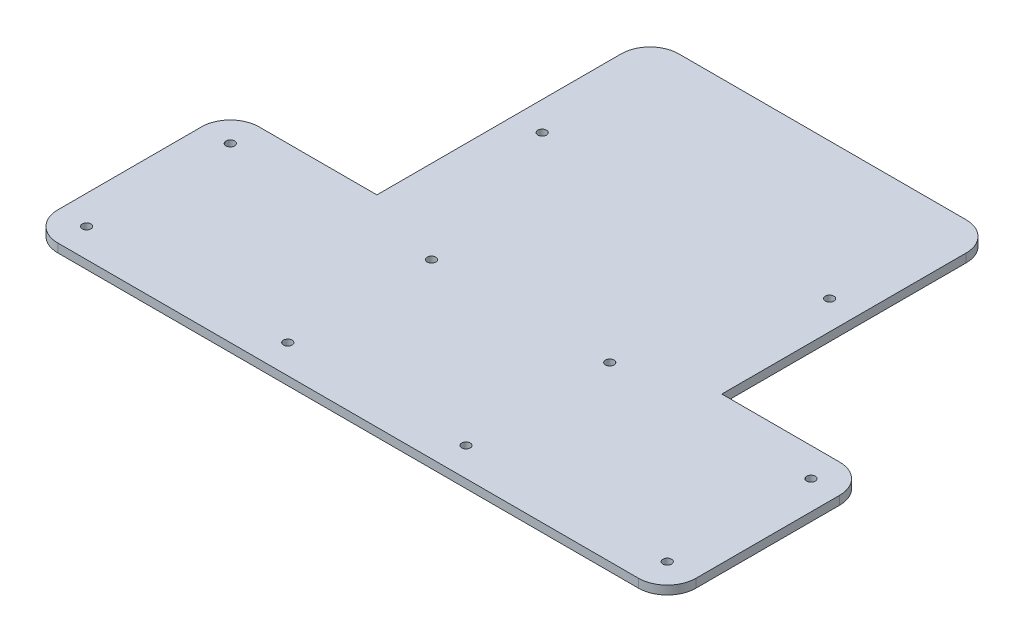
ISO-10303-21;
HEADER;
FILE_DESCRIPTION(('STEP AP214'),'2;1');
FILE_NAME('part.step','',(''),(''),'','','');
FILE_SCHEMA(('AUTOMOTIVE_DESIGN { 1 0 10303 214 1 1 1 1 }'));
ENDSEC;
DATA;
#1=APPLICATION_CONTEXT('core data for automotive mechanical design processes');
#2=APPLICATION_PROTOCOL_DEFINITION('international standard','automotive_design',2000,#1);
#3=PRODUCT_CONTEXT('',#1,'mechanical');
#4=PRODUCT('Part','Part','',(#3));
#5=PRODUCT_RELATED_PRODUCT_CATEGORY('part','',(#4));
#6=PRODUCT_DEFINITION_FORMATION('','',#4);
#7=PRODUCT_DEFINITION_CONTEXT('part definition',#1,'design');
#8=PRODUCT_DEFINITION('design','',#6,#7);
#9=PRODUCT_DEFINITION_SHAPE('','',#8);
#10=(LENGTH_UNIT() NAMED_UNIT(*) SI_UNIT(.MILLI.,.METRE.));
#11=(NAMED_UNIT(*) PLANE_ANGLE_UNIT() SI_UNIT($,.RADIAN.));
#12=(NAMED_UNIT(*) SI_UNIT($,.STERADIAN.) SOLID_ANGLE_UNIT());
#13=UNCERTAINTY_MEASURE_WITH_UNIT(LENGTH_MEASURE(1.E-05),#10,'distance_accuracy_value','');
#14=(GEOMETRIC_REPRESENTATION_CONTEXT(3) GLOBAL_UNCERTAINTY_ASSIGNED_CONTEXT((#13)) GLOBAL_UNIT_ASSIGNED_CONTEXT((#10,
#11,#12)) REPRESENTATION_CONTEXT('',''));
#15=CARTESIAN_POINT('',(0.,0.,0.));
#16=DIRECTION('',(0.,0.,1.));
#17=DIRECTION('',(1.,0.,0.));
#18=AXIS2_PLACEMENT_3D('',#15,#16,#17);
#19=CARTESIAN_POINT('',(0.,3.,0.));
#20=DIRECTION('',(0.,1.,0.));
#21=DIRECTION('',(0.,0.,1.));
#22=AXIS2_PLACEMENT_3D('',#19,#20,#21);
#23=PLANE('',#22);
#24=CARTESIAN_POINT('',(31.,3.,-25.));
#25=DIRECTION('',(0.,1.,0.));
#26=DIRECTION('',(0.,0.,-1.));
#27=AXIS2_PLACEMENT_3D('',#24,#25,#26);
#28=CIRCLE('',#27,1.5);
#29=CARTESIAN_POINT('',(31.,3.,-26.5));
#30=VERTEX_POINT('',#29);
#31=EDGE_CURVE('E335',#30,#30,#28,.T.);
#32=ORIENTED_EDGE('',*,*,#31,.F.);
#33=EDGE_LOOP('',(#32));
#34=FACE_BOUND('',#33,.T.);
#35=CARTESIAN_POINT('',(101.,3.,25.));
#36=DIRECTION('',(0.,1.,0.));
#37=DIRECTION('',(0.,0.,1.));
#38=AXIS2_PLACEMENT_3D('',#35,#36,#37);
#39=CIRCLE('',#38,1.5);
#40=CARTESIAN_POINT('',(101.,3.,26.5));
#41=VERTEX_POINT('',#40);
#42=EDGE_CURVE('E323',#41,#41,#39,.T.);
#43=ORIENTED_EDGE('',*,*,#42,.F.);
#44=EDGE_LOOP('',(#43));
#45=FACE_BOUND('',#44,.T.);
#46=CARTESIAN_POINT('',(-31.,3.,25.));
#47=DIRECTION('',(0.,1.,0.));
#48=DIRECTION('',(0.,0.,-1.));
#49=AXIS2_PLACEMENT_3D('',#46,#47,#48);
#50=CIRCLE('',#49,1.5);
#51=CARTESIAN_POINT('',(-31.,3.,23.5));
#52=VERTEX_POINT('',#51);
#53=EDGE_CURVE('E311',#52,#52,#50,.T.);
#54=ORIENTED_EDGE('',*,*,#53,.F.);
#55=EDGE_LOOP('',(#54));
#56=FACE_BOUND('',#55,.T.);
#57=CARTESIAN_POINT('',(-101.,3.,25.));
#58=DIRECTION('',(0.,1.,0.));
#59=DIRECTION('',(0.,0.,-1.));
#60=AXIS2_PLACEMENT_3D('',#57,#58,#59);
#61=CIRCLE('',#60,1.5);
#62=CARTESIAN_POINT('',(-101.,3.,23.5));
#63=VERTEX_POINT('',#62);
#64=EDGE_CURVE('E299',#63,#63,#61,.T.);
#65=ORIENTED_EDGE('',*,*,#64,.F.);
#66=EDGE_LOOP('',(#65));
#67=FACE_BOUND('',#66,.T.);
#68=CARTESIAN_POINT('',(-50.,3.,-82.5));
#69=DIRECTION('',(0.,1.,0.));
#70=DIRECTION('',(0.,0.,1.));
#71=AXIS2_PLACEMENT_3D('',#68,#69,#70);
#72=CIRCLE('',#71,1.5);
#73=CARTESIAN_POINT('',(-50.,3.,-81.));
#74=VERTEX_POINT('',#73);
#75=EDGE_CURVE('E179',#74,#74,#72,.T.);
#76=ORIENTED_EDGE('',*,*,#75,.F.);
#77=EDGE_LOOP('',(#76));
#78=FACE_BOUND('',#77,.T.);
#79=DIRECTION('',(-1.,0.,0.));
#80=VECTOR('',#79,1.);
#81=CARTESIAN_POINT('',(-60.,3.,-130.));
#82=LINE('',#81,#80);
#83=CARTESIAN_POINT('',(50.,3.,-130.));
#84=VERTEX_POINT('',#83);
#85=CARTESIAN_POINT('',(-50.,3.,-130.));
#86=VERTEX_POINT('',#85);
#87=EDGE_CURVE('E147',#84,#86,#82,.T.);
#88=ORIENTED_EDGE('',*,*,#87,.T.);
#89=CARTESIAN_POINT('',(-50.,3.,-120.));
#90=DIRECTION('',(0.,1.,0.));
#91=DIRECTION('',(0.,0.,1.));
#92=AXIS2_PLACEMENT_3D('',#89,#90,#91);
#93=CIRCLE('',#92,10.);
#94=CARTESIAN_POINT('',(-60.,3.,-120.));
#95=VERTEX_POINT('',#94);
#96=EDGE_CURVE('E143',#86,#95,#93,.T.);
#97=ORIENTED_EDGE('',*,*,#96,.T.);
#98=DIRECTION('',(0.,0.,1.));
#99=VECTOR('',#98,1.);
#100=CARTESIAN_POINT('',(-60.,3.,-130.));
#101=LINE('',#100,#99);
#102=CARTESIAN_POINT('',(-60.,3.,-35.));
#103=VERTEX_POINT('',#102);
#104=EDGE_CURVE('E135',#95,#103,#101,.T.);
#105=ORIENTED_EDGE('',*,*,#104,.T.);
#106=DIRECTION('',(-1.,0.,0.));
#107=VECTOR('',#106,1.);
#108=CARTESIAN_POINT('',(-60.,3.,-35.));
#109=LINE('',#108,#107);
#110=CARTESIAN_POINT('',(-101.,3.,-35.));
#111=VERTEX_POINT('',#110);
#112=EDGE_CURVE('E140',#103,#111,#109,.T.);
#113=ORIENTED_EDGE('',*,*,#112,.T.);
#114=CARTESIAN_POINT('',(-101.,3.,-25.));
#115=DIRECTION('',(0.,1.,0.));
#116=DIRECTION('',(0.,0.,1.));
#117=AXIS2_PLACEMENT_3D('',#114,#115,#116);
#118=CIRCLE('',#117,10.);
#119=CARTESIAN_POINT('',(-111.,3.,-25.));
#120=VERTEX_POINT('',#119);
#121=EDGE_CURVE('E216',#111,#120,#118,.T.);
#122=ORIENTED_EDGE('',*,*,#121,.T.);
#123=DIRECTION('',(0.,0.,1.));
#124=VECTOR('',#123,1.);
#125=CARTESIAN_POINT('',(-111.,3.,-35.));
#126=LINE('',#125,#124);
#127=CARTESIAN_POINT('',(-111.,3.,25.));
#128=VERTEX_POINT('',#127);
#129=EDGE_CURVE('E162',#120,#128,#126,.T.);
#130=ORIENTED_EDGE('',*,*,#129,.T.);
#131=CARTESIAN_POINT('',(-101.,3.,25.));
#132=DIRECTION('',(0.,1.,0.));
#133=DIRECTION('',(0.,0.,1.));
#134=AXIS2_PLACEMENT_3D('',#131,#132,#133);
#135=CIRCLE('',#134,10.);
#136=CARTESIAN_POINT('',(-101.,3.,35.));
#137=VERTEX_POINT('',#136);
#138=EDGE_CURVE('E218',#128,#137,#135,.T.);
#139=ORIENTED_EDGE('',*,*,#138,.T.);
#140=DIRECTION('',(1.,0.,0.));
#141=VECTOR('',#140,1.);
#142=CARTESIAN_POINT('',(111.,3.,35.));
#143=LINE('',#142,#141);
#144=CARTESIAN_POINT('',(101.,3.,35.));
#145=VERTEX_POINT('',#144);
#146=EDGE_CURVE('E165',#137,#145,#143,.T.);
#147=ORIENTED_EDGE('',*,*,#146,.T.);
#148=CARTESIAN_POINT('',(101.,3.,25.));
#149=DIRECTION('',(0.,1.,0.));
#150=DIRECTION('',(0.,0.,1.));
#151=AXIS2_PLACEMENT_3D('',#148,#149,#150);
#152=CIRCLE('',#151,10.);
#153=CARTESIAN_POINT('',(111.,3.,25.));
#154=VERTEX_POINT('',#153);
#155=EDGE_CURVE('E220',#145,#154,#152,.T.);
#156=ORIENTED_EDGE('',*,*,#155,.T.);
#157=DIRECTION('',(0.,0.,-1.));
#158=VECTOR('',#157,1.);
#159=CARTESIAN_POINT('',(111.,3.,-35.));
#160=LINE('',#159,#158);
#161=CARTESIAN_POINT('',(111.,3.,-25.));
#162=VERTEX_POINT('',#161);
#163=EDGE_CURVE('E171',#154,#162,#160,.T.);
#164=ORIENTED_EDGE('',*,*,#163,.T.);
#165=CARTESIAN_POINT('',(101.,3.,-25.));
#166=DIRECTION('',(0.,1.,0.));
#167=DIRECTION('',(0.,0.,1.));
#168=AXIS2_PLACEMENT_3D('',#165,#166,#167);
#169=CIRCLE('',#168,10.);
#170=CARTESIAN_POINT('',(101.,3.,-35.));
#171=VERTEX_POINT('',#170);
#172=EDGE_CURVE('E49',#162,#171,#169,.T.);
#173=ORIENTED_EDGE('',*,*,#172,.T.);
#174=DIRECTION('',(-1.,0.,0.));
#175=VECTOR('',#174,1.);
#176=CARTESIAN_POINT('',(60.,3.,-35.));
#177=LINE('',#176,#175);
#178=CARTESIAN_POINT('',(60.,3.,-35.));
#179=VERTEX_POINT('',#178);
#180=EDGE_CURVE('E173',#171,#179,#177,.T.);
#181=ORIENTED_EDGE('',*,*,#180,.T.);
#182=DIRECTION('',(0.,0.,-1.));
#183=VECTOR('',#182,1.);
#184=CARTESIAN_POINT('',(60.,3.,-130.));
#185=LINE('',#184,#183);
#186=CARTESIAN_POINT('',(60.,3.,-120.));
#187=VERTEX_POINT('',#186);
#188=EDGE_CURVE('E195',#179,#187,#185,.T.);
#189=ORIENTED_EDGE('',*,*,#188,.T.);
#190=CARTESIAN_POINT('',(50.,3.,-120.));
#191=DIRECTION('',(0.,1.,0.));
#192=DIRECTION('',(0.,0.,1.));
#193=AXIS2_PLACEMENT_3D('',#190,#191,#192);
#194=CIRCLE('',#193,10.);
#195=EDGE_CURVE('E223',#187,#84,#194,.T.);
#196=ORIENTED_EDGE('',*,*,#195,.T.);
#197=EDGE_LOOP('',(#88,#97,#105,#113,#122,#130,#139,#147,#156,#164,#173,#181,#189,#196));
#198=FACE_BOUND('',#197,.T.);
#199=CARTESIAN_POINT('',(-101.,3.,-25.));
#200=DIRECTION('',(0.,1.,0.));
#201=DIRECTION('',(0.,0.,1.));
#202=AXIS2_PLACEMENT_3D('',#199,#200,#201);
#203=CIRCLE('',#202,1.5);
#204=CARTESIAN_POINT('',(-101.,3.,-23.5));
#205=VERTEX_POINT('',#204);
#206=EDGE_CURVE('E293',#205,#205,#203,.T.);
#207=ORIENTED_EDGE('',*,*,#206,.F.);
#208=EDGE_LOOP('',(#207));
#209=FACE_BOUND('',#208,.T.);
#210=CARTESIAN_POINT('',(-31.,3.,-25.));
#211=DIRECTION('',(0.,1.,0.));
#212=DIRECTION('',(0.,0.,1.));
#213=AXIS2_PLACEMENT_3D('',#210,#211,#212);
#214=CIRCLE('',#213,1.5);
#215=CARTESIAN_POINT('',(-31.,3.,-23.5));
#216=VERTEX_POINT('',#215);
#217=EDGE_CURVE('E305',#216,#216,#214,.T.);
#218=ORIENTED_EDGE('',*,*,#217,.F.);
#219=EDGE_LOOP('',(#218));
#220=FACE_BOUND('',#219,.T.);
#221=CARTESIAN_POINT('',(101.,3.,-25.));
#222=DIRECTION('',(0.,1.,0.));
#223=DIRECTION('',(0.,0.,-1.));
#224=AXIS2_PLACEMENT_3D('',#221,#222,#223);
#225=CIRCLE('',#224,1.5);
#226=CARTESIAN_POINT('',(101.,3.,-26.5));
#227=VERTEX_POINT('',#226);
#228=EDGE_CURVE('E317',#227,#227,#225,.T.);
#229=ORIENTED_EDGE('',*,*,#228,.F.);
#230=EDGE_LOOP('',(#229));
#231=FACE_BOUND('',#230,.T.);
#232=CARTESIAN_POINT('',(31.,3.,25.));
#233=DIRECTION('',(0.,1.,0.));
#234=DIRECTION('',(0.,0.,1.));
#235=AXIS2_PLACEMENT_3D('',#232,#233,#234);
#236=CIRCLE('',#235,1.5);
#237=CARTESIAN_POINT('',(31.,3.,26.5));
#238=VERTEX_POINT('',#237);
#239=EDGE_CURVE('E329',#238,#238,#236,.T.);
#240=ORIENTED_EDGE('',*,*,#239,.F.);
#241=EDGE_LOOP('',(#240));
#242=FACE_BOUND('',#241,.T.);
#243=CARTESIAN_POINT('',(50.,3.,-82.5));
#244=DIRECTION('',(0.,1.,0.));
#245=DIRECTION('',(0.,0.,-1.));
#246=AXIS2_PLACEMENT_3D('',#243,#244,#245);
#247=CIRCLE('',#246,1.5);
#248=CARTESIAN_POINT('',(50.,3.,-84.));
#249=VERTEX_POINT('',#248);
#250=EDGE_CURVE('E341',#249,#249,#247,.T.);
#251=ORIENTED_EDGE('',*,*,#250,.F.);
#252=EDGE_LOOP('',(#251));
#253=FACE_BOUND('',#252,.T.);
#254=ADVANCED_FACE('F34',(#34,#45,#56,#67,#78,#198,#209,#220,#231,#242,#253),#23,.T.);
#255=CARTESIAN_POINT('',(0.,0.,0.));
#256=DIRECTION('',(0.,1.,0.));
#257=DIRECTION('',(0.,0.,1.));
#258=AXIS2_PLACEMENT_3D('',#255,#256,#257);
#259=PLANE('',#258);
#260=DIRECTION('',(0.,0.,1.));
#261=VECTOR('',#260,1.);
#262=CARTESIAN_POINT('',(-60.,0.,-130.));
#263=LINE('',#262,#261);
#264=CARTESIAN_POINT('',(-60.,0.,-120.));
#265=VERTEX_POINT('',#264);
#266=CARTESIAN_POINT('',(-60.,0.,-35.));
#267=VERTEX_POINT('',#266);
#268=EDGE_CURVE('E153',#265,#267,#263,.T.);
#269=ORIENTED_EDGE('',*,*,#268,.F.);
#270=CARTESIAN_POINT('',(-50.,0.,-120.));
#271=DIRECTION('',(0.,1.,0.));
#272=DIRECTION('',(0.,0.,1.));
#273=AXIS2_PLACEMENT_3D('',#270,#271,#272);
#274=CIRCLE('',#273,10.);
#275=CARTESIAN_POINT('',(-50.,0.,-130.));
#276=VERTEX_POINT('',#275);
#277=EDGE_CURVE('E209',#265,#276,#274,.F.);
#278=ORIENTED_EDGE('',*,*,#277,.T.);
#279=DIRECTION('',(-1.,0.,0.));
#280=VECTOR('',#279,1.);
#281=CARTESIAN_POINT('',(-60.,0.,-130.));
#282=LINE('',#281,#280);
#283=CARTESIAN_POINT('',(50.,0.,-130.));
#284=VERTEX_POINT('',#283);
#285=EDGE_CURVE('E178',#284,#276,#282,.T.);
#286=ORIENTED_EDGE('',*,*,#285,.F.);
#287=CARTESIAN_POINT('',(50.,0.,-120.));
#288=DIRECTION('',(0.,1.,0.));
#289=DIRECTION('',(0.,0.,1.));
#290=AXIS2_PLACEMENT_3D('',#287,#288,#289);
#291=CIRCLE('',#290,10.);
#292=CARTESIAN_POINT('',(60.,0.,-120.));
#293=VERTEX_POINT('',#292);
#294=EDGE_CURVE('E207',#284,#293,#291,.F.);
#295=ORIENTED_EDGE('',*,*,#294,.T.);
#296=DIRECTION('',(0.,0.,-1.));
#297=VECTOR('',#296,1.);
#298=CARTESIAN_POINT('',(60.,0.,-130.));
#299=LINE('',#298,#297);
#300=CARTESIAN_POINT('',(60.,0.,-35.));
#301=VERTEX_POINT('',#300);
#302=EDGE_CURVE('E175',#301,#293,#299,.T.);
#303=ORIENTED_EDGE('',*,*,#302,.F.);
#304=DIRECTION('',(-1.,0.,0.));
#305=VECTOR('',#304,1.);
#306=CARTESIAN_POINT('',(60.,0.,-35.));
#307=LINE('',#306,#305);
#308=CARTESIAN_POINT('',(101.,0.,-35.));
#309=VERTEX_POINT('',#308);
#310=EDGE_CURVE('E193',#309,#301,#307,.T.);
#311=ORIENTED_EDGE('',*,*,#310,.F.);
#312=CARTESIAN_POINT('',(101.,0.,-25.));
#313=DIRECTION('',(0.,1.,0.));
#314=DIRECTION('',(0.,0.,1.));
#315=AXIS2_PLACEMENT_3D('',#312,#313,#314);
#316=CIRCLE('',#315,10.);
#317=CARTESIAN_POINT('',(111.,0.,-25.));
#318=VERTEX_POINT('',#317);
#319=EDGE_CURVE('E205',#309,#318,#316,.F.);
#320=ORIENTED_EDGE('',*,*,#319,.T.);
#321=DIRECTION('',(0.,0.,-1.));
#322=VECTOR('',#321,1.);
#323=CARTESIAN_POINT('',(111.,0.,-35.));
#324=LINE('',#323,#322);
#325=CARTESIAN_POINT('',(111.,0.,25.));
#326=VERTEX_POINT('',#325);
#327=EDGE_CURVE('E191',#326,#318,#324,.T.);
#328=ORIENTED_EDGE('',*,*,#327,.F.);
#329=CARTESIAN_POINT('',(101.,0.,25.));
#330=DIRECTION('',(0.,1.,0.));
#331=DIRECTION('',(0.,0.,1.));
#332=AXIS2_PLACEMENT_3D('',#329,#330,#331);
#333=CIRCLE('',#332,10.);
#334=CARTESIAN_POINT('',(101.,0.,35.));
#335=VERTEX_POINT('',#334);
#336=EDGE_CURVE('E203',#326,#335,#333,.F.);
#337=ORIENTED_EDGE('',*,*,#336,.T.);
#338=DIRECTION('',(1.,0.,0.));
#339=VECTOR('',#338,1.);
#340=CARTESIAN_POINT('',(111.,0.,35.));
#341=LINE('',#340,#339);
#342=CARTESIAN_POINT('',(-101.,0.,35.));
#343=VERTEX_POINT('',#342);
#344=EDGE_CURVE('E188',#343,#335,#341,.T.);
#345=ORIENTED_EDGE('',*,*,#344,.F.);
#346=CARTESIAN_POINT('',(-101.,0.,25.));
#347=DIRECTION('',(0.,1.,0.));
#348=DIRECTION('',(0.,0.,1.));
#349=AXIS2_PLACEMENT_3D('',#346,#347,#348);
#350=CIRCLE('',#349,10.);
#351=CARTESIAN_POINT('',(-111.,0.,25.));
#352=VERTEX_POINT('',#351);
#353=EDGE_CURVE('E201',#343,#352,#350,.F.);
#354=ORIENTED_EDGE('',*,*,#353,.T.);
#355=DIRECTION('',(0.,0.,1.));
#356=VECTOR('',#355,1.);
#357=CARTESIAN_POINT('',(-111.,0.,-35.));
#358=LINE('',#357,#356);
#359=CARTESIAN_POINT('',(-111.,0.,-25.));
#360=VERTEX_POINT('',#359);
#361=EDGE_CURVE('E185',#360,#352,#358,.T.);
#362=ORIENTED_EDGE('',*,*,#361,.F.);
#363=CARTESIAN_POINT('',(-101.,0.,-25.));
#364=DIRECTION('',(0.,1.,0.));
#365=DIRECTION('',(0.,0.,1.));
#366=AXIS2_PLACEMENT_3D('',#363,#364,#365);
#367=CIRCLE('',#366,10.);
#368=CARTESIAN_POINT('',(-101.,0.,-35.));
#369=VERTEX_POINT('',#368);
#370=EDGE_CURVE('E199',#360,#369,#367,.F.);
#371=ORIENTED_EDGE('',*,*,#370,.T.);
#372=DIRECTION('',(-1.,0.,0.));
#373=VECTOR('',#372,1.);
#374=CARTESIAN_POINT('',(-60.,0.,-35.));
#375=LINE('',#374,#373);
#376=EDGE_CURVE('E183',#267,#369,#375,.T.);
#377=ORIENTED_EDGE('',*,*,#376,.F.);
#378=EDGE_LOOP('',(#269,#278,#286,#295,#303,#311,#320,#328,#337,#345,#354,#362,#371,#377));
#379=FACE_BOUND('',#378,.T.);
#380=CARTESIAN_POINT('',(-50.,0.,-82.5));
#381=DIRECTION('',(0.,1.,0.));
#382=DIRECTION('',(0.,0.,1.));
#383=AXIS2_PLACEMENT_3D('',#380,#381,#382);
#384=CIRCLE('',#383,1.5);
#385=CARTESIAN_POINT('',(-50.,0.,-81.));
#386=VERTEX_POINT('',#385);
#387=EDGE_CURVE('E290',#386,#386,#384,.T.);
#388=ORIENTED_EDGE('',*,*,#387,.T.);
#389=EDGE_LOOP('',(#388));
#390=FACE_BOUND('',#389,.T.);
#391=CARTESIAN_POINT('',(-101.,0.,-25.));
#392=DIRECTION('',(0.,1.,0.));
#393=DIRECTION('',(0.,0.,1.));
#394=AXIS2_PLACEMENT_3D('',#391,#392,#393);
#395=CIRCLE('',#394,1.5);
#396=CARTESIAN_POINT('',(-101.,0.,-23.5));
#397=VERTEX_POINT('',#396);
#398=EDGE_CURVE('E296',#397,#397,#395,.T.);
#399=ORIENTED_EDGE('',*,*,#398,.T.);
#400=EDGE_LOOP('',(#399));
#401=FACE_BOUND('',#400,.T.);
#402=CARTESIAN_POINT('',(-101.,0.,25.));
#403=DIRECTION('',(0.,1.,0.));
#404=DIRECTION('',(0.,0.,-1.));
#405=AXIS2_PLACEMENT_3D('',#402,#403,#404);
#406=CIRCLE('',#405,1.5);
#407=CARTESIAN_POINT('',(-101.,0.,23.5));
#408=VERTEX_POINT('',#407);
#409=EDGE_CURVE('E302',#408,#408,#406,.T.);
#410=ORIENTED_EDGE('',*,*,#409,.T.);
#411=EDGE_LOOP('',(#410));
#412=FACE_BOUND('',#411,.T.);
#413=CARTESIAN_POINT('',(-31.,0.,-25.));
#414=DIRECTION('',(0.,1.,0.));
#415=DIRECTION('',(0.,0.,1.));
#416=AXIS2_PLACEMENT_3D('',#413,#414,#415);
#417=CIRCLE('',#416,1.5);
#418=CARTESIAN_POINT('',(-31.,0.,-23.5));
#419=VERTEX_POINT('',#418);
#420=EDGE_CURVE('E308',#419,#419,#417,.T.);
#421=ORIENTED_EDGE('',*,*,#420,.T.);
#422=EDGE_LOOP('',(#421));
#423=FACE_BOUND('',#422,.T.);
#424=CARTESIAN_POINT('',(-31.,0.,25.));
#425=DIRECTION('',(0.,1.,0.));
#426=DIRECTION('',(0.,0.,-1.));
#427=AXIS2_PLACEMENT_3D('',#424,#425,#426);
#428=CIRCLE('',#427,1.5);
#429=CARTESIAN_POINT('',(-31.,0.,23.5));
#430=VERTEX_POINT('',#429);
#431=EDGE_CURVE('E314',#430,#430,#428,.T.);
#432=ORIENTED_EDGE('',*,*,#431,.T.);
#433=EDGE_LOOP('',(#432));
#434=FACE_BOUND('',#433,.T.);
#435=CARTESIAN_POINT('',(101.,0.,-25.));
#436=DIRECTION('',(0.,1.,0.));
#437=DIRECTION('',(0.,0.,-1.));
#438=AXIS2_PLACEMENT_3D('',#435,#436,#437);
#439=CIRCLE('',#438,1.5);
#440=CARTESIAN_POINT('',(101.,0.,-26.5));
#441=VERTEX_POINT('',#440);
#442=EDGE_CURVE('E320',#441,#441,#439,.T.);
#443=ORIENTED_EDGE('',*,*,#442,.T.);
#444=EDGE_LOOP('',(#443));
#445=FACE_BOUND('',#444,.T.);
#446=CARTESIAN_POINT('',(101.,0.,25.));
#447=DIRECTION('',(0.,1.,0.));
#448=DIRECTION('',(0.,0.,1.));
#449=AXIS2_PLACEMENT_3D('',#446,#447,#448);
#450=CIRCLE('',#449,1.5);
#451=CARTESIAN_POINT('',(101.,0.,26.5));
#452=VERTEX_POINT('',#451);
#453=EDGE_CURVE('E326',#452,#452,#450,.T.);
#454=ORIENTED_EDGE('',*,*,#453,.T.);
#455=EDGE_LOOP('',(#454));
#456=FACE_BOUND('',#455,.T.);
#457=CARTESIAN_POINT('',(31.,0.,25.));
#458=DIRECTION('',(0.,1.,0.));
#459=DIRECTION('',(0.,0.,1.));
#460=AXIS2_PLACEMENT_3D('',#457,#458,#459);
#461=CIRCLE('',#460,1.5);
#462=CARTESIAN_POINT('',(31.,0.,26.5));
#463=VERTEX_POINT('',#462);
#464=EDGE_CURVE('E332',#463,#463,#461,.T.);
#465=ORIENTED_EDGE('',*,*,#464,.T.);
#466=EDGE_LOOP('',(#465));
#467=FACE_BOUND('',#466,.T.);
#468=CARTESIAN_POINT('',(31.,0.,-25.));
#469=DIRECTION('',(0.,1.,0.));
#470=DIRECTION('',(0.,0.,-1.));
#471=AXIS2_PLACEMENT_3D('',#468,#469,#470);
#472=CIRCLE('',#471,1.5);
#473=CARTESIAN_POINT('',(31.,0.,-26.5));
#474=VERTEX_POINT('',#473);
#475=EDGE_CURVE('E338',#474,#474,#472,.T.);
#476=ORIENTED_EDGE('',*,*,#475,.T.);
#477=EDGE_LOOP('',(#476));
#478=FACE_BOUND('',#477,.T.);
#479=CARTESIAN_POINT('',(50.,0.,-82.5));
#480=DIRECTION('',(0.,1.,0.));
#481=DIRECTION('',(0.,0.,-1.));
#482=AXIS2_PLACEMENT_3D('',#479,#480,#481);
#483=CIRCLE('',#482,1.5);
#484=CARTESIAN_POINT('',(50.,0.,-84.));
#485=VERTEX_POINT('',#484);
#486=EDGE_CURVE('E344',#485,#485,#483,.T.);
#487=ORIENTED_EDGE('',*,*,#486,.T.);
#488=EDGE_LOOP('',(#487));
#489=FACE_BOUND('',#488,.T.);
#490=ADVANCED_FACE('F258',(#379,#390,#401,#412,#423,#434,#445,#456,#467,#478,#489),#259,.F.);
#491=CARTESIAN_POINT('',(60.,3.,-130.));
#492=DIRECTION('',(-1.,0.,0.));
#493=DIRECTION('',(0.,0.,1.));
#494=AXIS2_PLACEMENT_3D('',#491,#492,#493);
#495=PLANE('',#494);
#496=ORIENTED_EDGE('',*,*,#302,.T.);
#497=DIRECTION('',(0.,-1.,0.));
#498=VECTOR('',#497,1.);
#499=CARTESIAN_POINT('',(60.,3.,-120.));
#500=LINE('',#499,#498);
#501=EDGE_CURVE('E226',#293,#187,#500,.F.);
#502=ORIENTED_EDGE('',*,*,#501,.T.);
#503=ORIENTED_EDGE('',*,*,#188,.F.);
#504=DIRECTION('',(0.,-1.,0.));
#505=VECTOR('',#504,1.);
#506=CARTESIAN_POINT('',(60.,3.,-35.));
#507=LINE('',#506,#505);
#508=EDGE_CURVE('E158',#179,#301,#507,.T.);
#509=ORIENTED_EDGE('',*,*,#508,.T.);
#510=EDGE_LOOP('',(#496,#502,#503,#509));
#511=FACE_BOUND('',#510,.T.);
#512=ADVANCED_FACE('F277',(#511),#495,.F.);
#513=CARTESIAN_POINT('',(-60.,3.,-130.));
#514=DIRECTION('',(0.,0.,1.));
#515=DIRECTION('',(1.,0.,0.));
#516=AXIS2_PLACEMENT_3D('',#513,#514,#515);
#517=PLANE('',#516);
#518=ORIENTED_EDGE('',*,*,#285,.T.);
#519=DIRECTION('',(0.,-1.,0.));
#520=VECTOR('',#519,1.);
#521=CARTESIAN_POINT('',(-50.,3.,-130.));
#522=LINE('',#521,#520);
#523=EDGE_CURVE('E214',#276,#86,#522,.F.);
#524=ORIENTED_EDGE('',*,*,#523,.T.);
#525=ORIENTED_EDGE('',*,*,#87,.F.);
#526=DIRECTION('',(0.,-1.,0.));
#527=VECTOR('',#526,1.);
#528=CARTESIAN_POINT('',(50.,3.,-130.));
#529=LINE('',#528,#527);
#530=EDGE_CURVE('E211',#84,#284,#529,.T.);
#531=ORIENTED_EDGE('',*,*,#530,.T.);
#532=EDGE_LOOP('',(#518,#524,#525,#531));
#533=FACE_BOUND('',#532,.T.);
#534=ADVANCED_FACE('F286',(#533),#517,.F.);
#535=CARTESIAN_POINT('',(-60.,3.,-130.));
#536=DIRECTION('',(1.,0.,0.));
#537=DIRECTION('',(0.,0.,-1.));
#538=AXIS2_PLACEMENT_3D('',#535,#536,#537);
#539=PLANE('',#538);
#540=ORIENTED_EDGE('',*,*,#104,.F.);
#541=DIRECTION('',(0.,-1.,0.));
#542=VECTOR('',#541,1.);
#543=CARTESIAN_POINT('',(-60.,3.,-120.));
#544=LINE('',#543,#542);
#545=EDGE_CURVE('E157',#95,#265,#544,.T.);
#546=ORIENTED_EDGE('',*,*,#545,.T.);
#547=ORIENTED_EDGE('',*,*,#268,.T.);
#548=DIRECTION('',(0.,-1.,0.));
#549=VECTOR('',#548,1.);
#550=CARTESIAN_POINT('',(-60.,3.,-35.));
#551=LINE('',#550,#549);
#552=EDGE_CURVE('E150',#103,#267,#551,.T.);
#553=ORIENTED_EDGE('',*,*,#552,.F.);
#554=EDGE_LOOP('',(#540,#546,#547,#553));
#555=FACE_BOUND('',#554,.T.);
#556=ADVANCED_FACE('F151',(#555),#539,.F.);
#557=CARTESIAN_POINT('',(-60.,3.,-35.));
#558=DIRECTION('',(0.,0.,1.));
#559=DIRECTION('',(1.,0.,0.));
#560=AXIS2_PLACEMENT_3D('',#557,#558,#559);
#561=PLANE('',#560);
#562=ORIENTED_EDGE('',*,*,#376,.T.);
#563=DIRECTION('',(0.,-1.,0.));
#564=VECTOR('',#563,1.);
#565=CARTESIAN_POINT('',(-101.,3.,-35.));
#566=LINE('',#565,#564);
#567=EDGE_CURVE('E11',#369,#111,#566,.F.);
#568=ORIENTED_EDGE('',*,*,#567,.T.);
#569=ORIENTED_EDGE('',*,*,#112,.F.);
#570=ORIENTED_EDGE('',*,*,#552,.T.);
#571=EDGE_LOOP('',(#562,#568,#569,#570));
#572=FACE_BOUND('',#571,.T.);
#573=ADVANCED_FACE('F160',(#572),#561,.F.);
#574=CARTESIAN_POINT('',(-111.,3.,-35.));
#575=DIRECTION('',(1.,0.,0.));
#576=DIRECTION('',(0.,0.,-1.));
#577=AXIS2_PLACEMENT_3D('',#574,#575,#576);
#578=PLANE('',#577);
#579=ORIENTED_EDGE('',*,*,#361,.T.);
#580=DIRECTION('',(0.,-1.,0.));
#581=VECTOR('',#580,1.);
#582=CARTESIAN_POINT('',(-111.,3.,25.));
#583=LINE('',#582,#581);
#584=EDGE_CURVE('E42',#352,#128,#583,.F.);
#585=ORIENTED_EDGE('',*,*,#584,.T.);
#586=ORIENTED_EDGE('',*,*,#129,.F.);
#587=DIRECTION('',(0.,-1.,0.));
#588=VECTOR('',#587,1.);
#589=CARTESIAN_POINT('',(-111.,3.,-25.));
#590=LINE('',#589,#588);
#591=EDGE_CURVE('E240',#120,#360,#590,.T.);
#592=ORIENTED_EDGE('',*,*,#591,.T.);
#593=EDGE_LOOP('',(#579,#585,#586,#592));
#594=FACE_BOUND('',#593,.T.);
#595=ADVANCED_FACE('F245',(#594),#578,.F.);
#596=CARTESIAN_POINT('',(111.,3.,35.));
#597=DIRECTION('',(0.,0.,-1.));
#598=DIRECTION('',(-1.,0.,0.));
#599=AXIS2_PLACEMENT_3D('',#596,#597,#598);
#600=PLANE('',#599);
#601=ORIENTED_EDGE('',*,*,#344,.T.);
#602=DIRECTION('',(0.,-1.,0.));
#603=VECTOR('',#602,1.);
#604=CARTESIAN_POINT('',(101.,3.,35.));
#605=LINE('',#604,#603);
#606=EDGE_CURVE('E238',#335,#145,#605,.F.);
#607=ORIENTED_EDGE('',*,*,#606,.T.);
#608=ORIENTED_EDGE('',*,*,#146,.F.);
#609=DIRECTION('',(0.,-1.,0.));
#610=VECTOR('',#609,1.);
#611=CARTESIAN_POINT('',(-101.,3.,35.));
#612=LINE('',#611,#610);
#613=EDGE_CURVE('E235',#137,#343,#612,.T.);
#614=ORIENTED_EDGE('',*,*,#613,.T.);
#615=EDGE_LOOP('',(#601,#607,#608,#614));
#616=FACE_BOUND('',#615,.T.);
#617=ADVANCED_FACE('F255',(#616),#600,.F.);
#618=CARTESIAN_POINT('',(111.,3.,-35.));
#619=DIRECTION('',(-1.,0.,0.));
#620=DIRECTION('',(0.,0.,1.));
#621=AXIS2_PLACEMENT_3D('',#618,#619,#620);
#622=PLANE('',#621);
#623=ORIENTED_EDGE('',*,*,#327,.T.);
#624=DIRECTION('',(0.,-1.,0.));
#625=VECTOR('',#624,1.);
#626=CARTESIAN_POINT('',(111.,3.,-25.));
#627=LINE('',#626,#625);
#628=EDGE_CURVE('E57',#318,#162,#627,.F.);
#629=ORIENTED_EDGE('',*,*,#628,.T.);
#630=ORIENTED_EDGE('',*,*,#163,.F.);
#631=DIRECTION('',(0.,-1.,0.));
#632=VECTOR('',#631,1.);
#633=CARTESIAN_POINT('',(111.,3.,25.));
#634=LINE('',#633,#632);
#635=EDGE_CURVE('E231',#154,#326,#634,.T.);
#636=ORIENTED_EDGE('',*,*,#635,.T.);
#637=EDGE_LOOP('',(#623,#629,#630,#636));
#638=FACE_BOUND('',#637,.T.);
#639=ADVANCED_FACE('F265',(#638),#622,.F.);
#640=CARTESIAN_POINT('',(60.,3.,-35.));
#641=DIRECTION('',(0.,0.,1.));
#642=DIRECTION('',(1.,0.,0.));
#643=AXIS2_PLACEMENT_3D('',#640,#641,#642);
#644=PLANE('',#643);
#645=ORIENTED_EDGE('',*,*,#180,.F.);
#646=DIRECTION('',(0.,-1.,0.));
#647=VECTOR('',#646,1.);
#648=CARTESIAN_POINT('',(101.,3.,-35.));
#649=LINE('',#648,#647);
#650=EDGE_CURVE('E228',#171,#309,#649,.T.);
#651=ORIENTED_EDGE('',*,*,#650,.T.);
#652=ORIENTED_EDGE('',*,*,#310,.T.);
#653=ORIENTED_EDGE('',*,*,#508,.F.);
#654=EDGE_LOOP('',(#645,#651,#652,#653));
#655=FACE_BOUND('',#654,.T.);
#656=ADVANCED_FACE('F271',(#655),#644,.F.);
#657=CARTESIAN_POINT('',(-50.,3.,-82.5));
#658=DIRECTION('',(0.,-1.,0.));
#659=DIRECTION('',(0.,0.,-1.));
#660=AXIS2_PLACEMENT_3D('',#657,#658,#659);
#661=CYLINDRICAL_SURFACE('',#660,1.5);
#662=ORIENTED_EDGE('',*,*,#75,.T.);
#663=EDGE_LOOP('',(#662));
#664=FACE_BOUND('',#663,.T.);
#665=ORIENTED_EDGE('',*,*,#387,.F.);
#666=EDGE_LOOP('',(#665));
#667=FACE_BOUND('',#666,.T.);
#668=ADVANCED_FACE('F363',(#664,#667),#661,.F.);
#669=CARTESIAN_POINT('',(-101.,3.,-25.));
#670=DIRECTION('',(0.,-1.,0.));
#671=DIRECTION('',(0.,0.,-1.));
#672=AXIS2_PLACEMENT_3D('',#669,#670,#671);
#673=CYLINDRICAL_SURFACE('',#672,1.5);
#674=ORIENTED_EDGE('',*,*,#206,.T.);
#675=EDGE_LOOP('',(#674));
#676=FACE_BOUND('',#675,.T.);
#677=ORIENTED_EDGE('',*,*,#398,.F.);
#678=EDGE_LOOP('',(#677));
#679=FACE_BOUND('',#678,.T.);
#680=ADVANCED_FACE('F564',(#676,#679),#673,.F.);
#681=CARTESIAN_POINT('',(-101.,3.,25.));
#682=DIRECTION('',(0.,-1.,0.));
#683=DIRECTION('',(0.,0.,-1.));
#684=AXIS2_PLACEMENT_3D('',#681,#682,#683);
#685=CYLINDRICAL_SURFACE('',#684,1.5);
#686=ORIENTED_EDGE('',*,*,#64,.T.);
#687=EDGE_LOOP('',(#686));
#688=FACE_BOUND('',#687,.T.);
#689=ORIENTED_EDGE('',*,*,#409,.F.);
#690=EDGE_LOOP('',(#689));
#691=FACE_BOUND('',#690,.T.);
#692=ADVANCED_FACE('F554',(#688,#691),#685,.F.);
#693=CARTESIAN_POINT('',(-31.,3.,-25.));
#694=DIRECTION('',(0.,-1.,0.));
#695=DIRECTION('',(0.,0.,-1.));
#696=AXIS2_PLACEMENT_3D('',#693,#694,#695);
#697=CYLINDRICAL_SURFACE('',#696,1.5);
#698=ORIENTED_EDGE('',*,*,#217,.T.);
#699=EDGE_LOOP('',(#698));
#700=FACE_BOUND('',#699,.T.);
#701=ORIENTED_EDGE('',*,*,#420,.F.);
#702=EDGE_LOOP('',(#701));
#703=FACE_BOUND('',#702,.T.);
#704=ADVANCED_FACE('F544',(#700,#703),#697,.F.);
#705=CARTESIAN_POINT('',(-31.,3.,25.));
#706=DIRECTION('',(0.,-1.,0.));
#707=DIRECTION('',(0.,0.,-1.));
#708=AXIS2_PLACEMENT_3D('',#705,#706,#707);
#709=CYLINDRICAL_SURFACE('',#708,1.5);
#710=ORIENTED_EDGE('',*,*,#53,.T.);
#711=EDGE_LOOP('',(#710));
#712=FACE_BOUND('',#711,.T.);
#713=ORIENTED_EDGE('',*,*,#431,.F.);
#714=EDGE_LOOP('',(#713));
#715=FACE_BOUND('',#714,.T.);
#716=ADVANCED_FACE('F534',(#712,#715),#709,.F.);
#717=CARTESIAN_POINT('',(101.,3.,-25.));
#718=DIRECTION('',(0.,-1.,0.));
#719=DIRECTION('',(0.,0.,-1.));
#720=AXIS2_PLACEMENT_3D('',#717,#718,#719);
#721=CYLINDRICAL_SURFACE('',#720,1.5);
#722=ORIENTED_EDGE('',*,*,#228,.T.);
#723=EDGE_LOOP('',(#722));
#724=FACE_BOUND('',#723,.T.);
#725=ORIENTED_EDGE('',*,*,#442,.F.);
#726=EDGE_LOOP('',(#725));
#727=FACE_BOUND('',#726,.T.);
#728=ADVANCED_FACE('F524',(#724,#727),#721,.F.);
#729=CARTESIAN_POINT('',(101.,3.,25.));
#730=DIRECTION('',(0.,-1.,0.));
#731=DIRECTION('',(0.,0.,-1.));
#732=AXIS2_PLACEMENT_3D('',#729,#730,#731);
#733=CYLINDRICAL_SURFACE('',#732,1.5);
#734=ORIENTED_EDGE('',*,*,#42,.T.);
#735=EDGE_LOOP('',(#734));
#736=FACE_BOUND('',#735,.T.);
#737=ORIENTED_EDGE('',*,*,#453,.F.);
#738=EDGE_LOOP('',(#737));
#739=FACE_BOUND('',#738,.T.);
#740=ADVANCED_FACE('F514',(#736,#739),#733,.F.);
#741=CARTESIAN_POINT('',(31.,3.,25.));
#742=DIRECTION('',(0.,-1.,0.));
#743=DIRECTION('',(0.,0.,-1.));
#744=AXIS2_PLACEMENT_3D('',#741,#742,#743);
#745=CYLINDRICAL_SURFACE('',#744,1.5);
#746=ORIENTED_EDGE('',*,*,#239,.T.);
#747=EDGE_LOOP('',(#746));
#748=FACE_BOUND('',#747,.T.);
#749=ORIENTED_EDGE('',*,*,#464,.F.);
#750=EDGE_LOOP('',(#749));
#751=FACE_BOUND('',#750,.T.);
#752=ADVANCED_FACE('F504',(#748,#751),#745,.F.);
#753=CARTESIAN_POINT('',(31.,3.,-25.));
#754=DIRECTION('',(0.,-1.,0.));
#755=DIRECTION('',(0.,0.,-1.));
#756=AXIS2_PLACEMENT_3D('',#753,#754,#755);
#757=CYLINDRICAL_SURFACE('',#756,1.5);
#758=ORIENTED_EDGE('',*,*,#31,.T.);
#759=EDGE_LOOP('',(#758));
#760=FACE_BOUND('',#759,.T.);
#761=ORIENTED_EDGE('',*,*,#475,.F.);
#762=EDGE_LOOP('',(#761));
#763=FACE_BOUND('',#762,.T.);
#764=ADVANCED_FACE('F495',(#760,#763),#757,.F.);
#765=CARTESIAN_POINT('',(50.,3.,-82.5));
#766=DIRECTION('',(0.,-1.,0.));
#767=DIRECTION('',(0.,0.,-1.));
#768=AXIS2_PLACEMENT_3D('',#765,#766,#767);
#769=CYLINDRICAL_SURFACE('',#768,1.5);
#770=ORIENTED_EDGE('',*,*,#250,.T.);
#771=EDGE_LOOP('',(#770));
#772=FACE_BOUND('',#771,.T.);
#773=ORIENTED_EDGE('',*,*,#486,.F.);
#774=EDGE_LOOP('',(#773));
#775=FACE_BOUND('',#774,.T.);
#776=ADVANCED_FACE('F350',(#772,#775),#769,.F.);
#777=CARTESIAN_POINT('',(-50.,3.,-120.));
#778=DIRECTION('',(0.,-1.,0.));
#779=DIRECTION('',(0.,0.,-1.));
#780=AXIS2_PLACEMENT_3D('',#777,#778,#779);
#781=CYLINDRICAL_SURFACE('',#780,10.);
#782=ORIENTED_EDGE('',*,*,#96,.F.);
#783=ORIENTED_EDGE('',*,*,#523,.F.);
#784=ORIENTED_EDGE('',*,*,#277,.F.);
#785=ORIENTED_EDGE('',*,*,#545,.F.);
#786=EDGE_LOOP('',(#782,#783,#784,#785));
#787=FACE_BOUND('',#786,.T.);
#788=ADVANCED_FACE('F382',(#787),#781,.T.);
#789=CARTESIAN_POINT('',(50.,3.,-120.));
#790=DIRECTION('',(0.,-1.,0.));
#791=DIRECTION('',(0.,0.,-1.));
#792=AXIS2_PLACEMENT_3D('',#789,#790,#791);
#793=CYLINDRICAL_SURFACE('',#792,10.);
#794=ORIENTED_EDGE('',*,*,#195,.F.);
#795=ORIENTED_EDGE('',*,*,#501,.F.);
#796=ORIENTED_EDGE('',*,*,#294,.F.);
#797=ORIENTED_EDGE('',*,*,#530,.F.);
#798=EDGE_LOOP('',(#794,#795,#796,#797));
#799=FACE_BOUND('',#798,.T.);
#800=ADVANCED_FACE('F282',(#799),#793,.T.);
#801=CARTESIAN_POINT('',(101.,3.,-25.));
#802=DIRECTION('',(0.,-1.,0.));
#803=DIRECTION('',(0.,0.,-1.));
#804=AXIS2_PLACEMENT_3D('',#801,#802,#803);
#805=CYLINDRICAL_SURFACE('',#804,10.);
#806=ORIENTED_EDGE('',*,*,#172,.F.);
#807=ORIENTED_EDGE('',*,*,#628,.F.);
#808=ORIENTED_EDGE('',*,*,#319,.F.);
#809=ORIENTED_EDGE('',*,*,#650,.F.);
#810=EDGE_LOOP('',(#806,#807,#808,#809));
#811=FACE_BOUND('',#810,.T.);
#812=ADVANCED_FACE('F268',(#811),#805,.T.);
#813=CARTESIAN_POINT('',(101.,3.,25.));
#814=DIRECTION('',(0.,-1.,0.));
#815=DIRECTION('',(0.,0.,-1.));
#816=AXIS2_PLACEMENT_3D('',#813,#814,#815);
#817=CYLINDRICAL_SURFACE('',#816,10.);
#818=ORIENTED_EDGE('',*,*,#155,.F.);
#819=ORIENTED_EDGE('',*,*,#606,.F.);
#820=ORIENTED_EDGE('',*,*,#336,.F.);
#821=ORIENTED_EDGE('',*,*,#635,.F.);
#822=EDGE_LOOP('',(#818,#819,#820,#821));
#823=FACE_BOUND('',#822,.T.);
#824=ADVANCED_FACE('F264',(#823),#817,.T.);
#825=CARTESIAN_POINT('',(-101.,3.,25.));
#826=DIRECTION('',(0.,-1.,0.));
#827=DIRECTION('',(0.,0.,-1.));
#828=AXIS2_PLACEMENT_3D('',#825,#826,#827);
#829=CYLINDRICAL_SURFACE('',#828,10.);
#830=ORIENTED_EDGE('',*,*,#138,.F.);
#831=ORIENTED_EDGE('',*,*,#584,.F.);
#832=ORIENTED_EDGE('',*,*,#353,.F.);
#833=ORIENTED_EDGE('',*,*,#613,.F.);
#834=EDGE_LOOP('',(#830,#831,#832,#833));
#835=FACE_BOUND('',#834,.T.);
#836=ADVANCED_FACE('F252',(#835),#829,.T.);
#837=CARTESIAN_POINT('',(-101.,3.,-25.));
#838=DIRECTION('',(0.,-1.,0.));
#839=DIRECTION('',(0.,0.,-1.));
#840=AXIS2_PLACEMENT_3D('',#837,#838,#839);
#841=CYLINDRICAL_SURFACE('',#840,10.);
#842=ORIENTED_EDGE('',*,*,#121,.F.);
#843=ORIENTED_EDGE('',*,*,#567,.F.);
#844=ORIENTED_EDGE('',*,*,#370,.F.);
#845=ORIENTED_EDGE('',*,*,#591,.F.);
#846=EDGE_LOOP('',(#842,#843,#844,#845));
#847=FACE_BOUND('',#846,.T.);
#848=ADVANCED_FACE('F36',(#847),#841,.T.);
#849=CLOSED_SHELL('',(#254,#490,#512,#534,#556,#573,#595,#617,#639,#656,#668,#680,#692,#704,
#716,#728,#740,#752,#764,#776,#788,#800,#812,#824,#836,#848));
#850=MANIFOLD_SOLID_BREP('B2',#849);
#851=ADVANCED_BREP_SHAPE_REPRESENTATION('',(#18,#850),#14);
#852=SHAPE_DEFINITION_REPRESENTATION(#9,#851);
ENDSEC;
END-ISO-10303-21;
